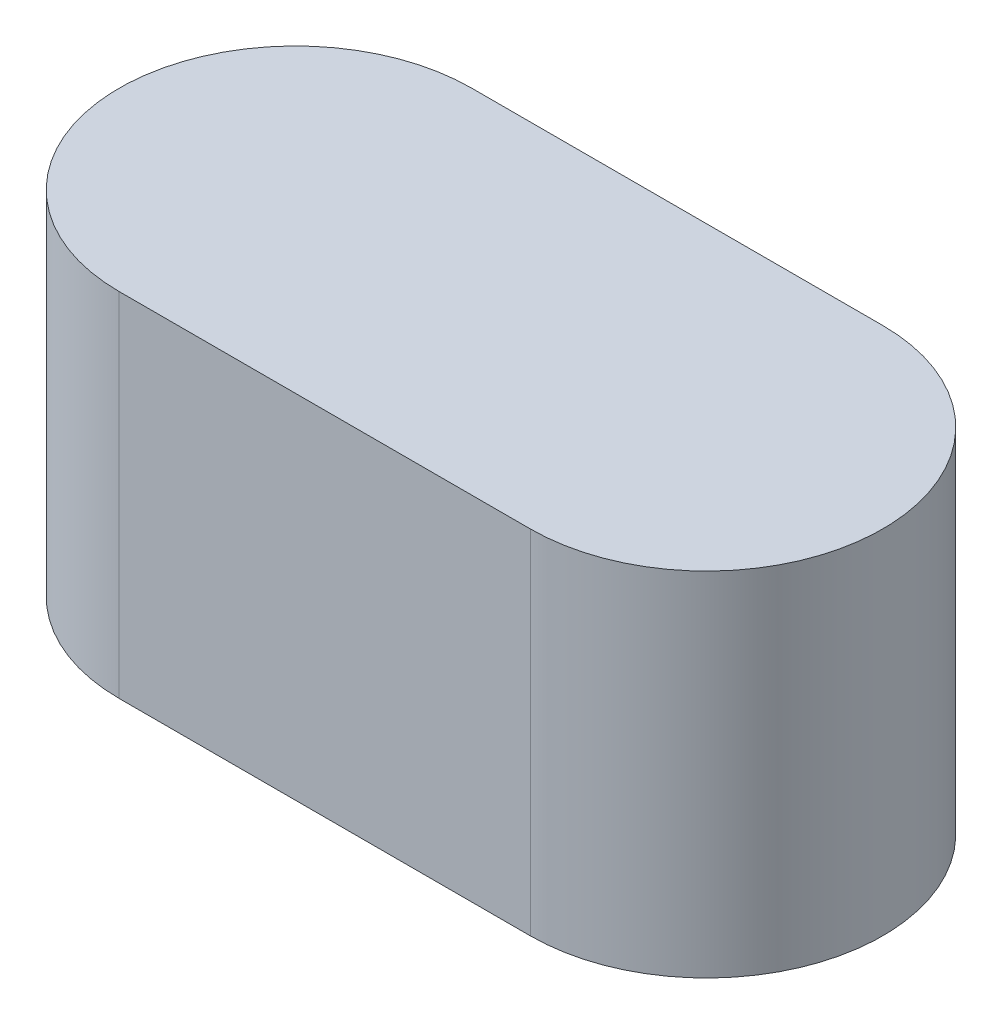
ISO-10303-21;
HEADER;
FILE_DESCRIPTION(('STEP AP214'),'2;1');
FILE_NAME('part.step','',(''),(''),'','','');
FILE_SCHEMA(('AUTOMOTIVE_DESIGN { 1 0 10303 214 1 1 1 1 }'));
ENDSEC;
DATA;
#1=APPLICATION_CONTEXT('core data for automotive mechanical design processes');
#2=APPLICATION_PROTOCOL_DEFINITION('international standard','automotive_design',2000,#1);
#3=PRODUCT_CONTEXT('',#1,'mechanical');
#4=PRODUCT('Part','Part','',(#3));
#5=PRODUCT_RELATED_PRODUCT_CATEGORY('part','',(#4));
#6=PRODUCT_DEFINITION_FORMATION('','',#4);
#7=PRODUCT_DEFINITION_CONTEXT('part definition',#1,'design');
#8=PRODUCT_DEFINITION('design','',#6,#7);
#9=PRODUCT_DEFINITION_SHAPE('','',#8);
#10=(LENGTH_UNIT() NAMED_UNIT(*) SI_UNIT(.MILLI.,.METRE.));
#11=(NAMED_UNIT(*) PLANE_ANGLE_UNIT() SI_UNIT($,.RADIAN.));
#12=(NAMED_UNIT(*) SI_UNIT($,.STERADIAN.) SOLID_ANGLE_UNIT());
#13=UNCERTAINTY_MEASURE_WITH_UNIT(LENGTH_MEASURE(1.E-05),#10,'distance_accuracy_value','');
#14=(GEOMETRIC_REPRESENTATION_CONTEXT(3) GLOBAL_UNCERTAINTY_ASSIGNED_CONTEXT((#13)) GLOBAL_UNIT_ASSIGNED_CONTEXT((#10,
#11,#12)) REPRESENTATION_CONTEXT('',''));
#15=CARTESIAN_POINT('',(0.,0.,0.));
#16=DIRECTION('',(0.,0.,1.));
#17=DIRECTION('',(1.,0.,0.));
#18=AXIS2_PLACEMENT_3D('',#15,#16,#17);
#19=CARTESIAN_POINT('',(3.5,6.,0.));
#20=DIRECTION('',(0.,-1.,0.));
#21=DIRECTION('',(0.,0.,-1.));
#22=AXIS2_PLACEMENT_3D('',#19,#20,#21);
#23=CYLINDRICAL_SURFACE('',#22,3.);
#24=CARTESIAN_POINT('',(3.5,0.,0.));
#25=DIRECTION('',(0.,1.,0.));
#26=DIRECTION('',(0.,0.,1.));
#27=AXIS2_PLACEMENT_3D('',#24,#25,#26);
#28=CIRCLE('',#27,3.);
#29=CARTESIAN_POINT('',(3.5,0.,3.));
#30=VERTEX_POINT('',#29);
#31=CARTESIAN_POINT('',(3.5,0.,-3.));
#32=VERTEX_POINT('',#31);
#33=EDGE_CURVE('E107',#30,#32,#28,.T.);
#34=ORIENTED_EDGE('',*,*,#33,.T.);
#35=DIRECTION('',(0.,-1.,0.));
#36=VECTOR('',#35,1.);
#37=CARTESIAN_POINT('',(3.5,6.,-3.));
#38=LINE('',#37,#36);
#39=CARTESIAN_POINT('',(3.5,6.,-3.));
#40=VERTEX_POINT('',#39);
#41=EDGE_CURVE('E11',#40,#32,#38,.T.);
#42=ORIENTED_EDGE('',*,*,#41,.F.);
#43=CARTESIAN_POINT('',(3.5,6.,0.));
#44=DIRECTION('',(0.,1.,0.));
#45=DIRECTION('',(0.,0.,1.));
#46=AXIS2_PLACEMENT_3D('',#43,#44,#45);
#47=CIRCLE('',#46,3.);
#48=CARTESIAN_POINT('',(3.5,6.,3.));
#49=VERTEX_POINT('',#48);
#50=EDGE_CURVE('E91',#49,#40,#47,.T.);
#51=ORIENTED_EDGE('',*,*,#50,.F.);
#52=DIRECTION('',(0.,-1.,0.));
#53=VECTOR('',#52,1.);
#54=CARTESIAN_POINT('',(3.5,6.,3.));
#55=LINE('',#54,#53);
#56=EDGE_CURVE('E103',#49,#30,#55,.T.);
#57=ORIENTED_EDGE('',*,*,#56,.T.);
#58=EDGE_LOOP('',(#34,#42,#51,#57));
#59=FACE_BOUND('',#58,.T.);
#60=ADVANCED_FACE('F39',(#59),#23,.T.);
#61=CARTESIAN_POINT('',(-3.5,6.,-3.));
#62=DIRECTION('',(0.,0.,1.));
#63=DIRECTION('',(1.,0.,0.));
#64=AXIS2_PLACEMENT_3D('',#61,#62,#63);
#65=PLANE('',#64);
#66=DIRECTION('',(-1.,0.,0.));
#67=VECTOR('',#66,1.);
#68=CARTESIAN_POINT('',(-3.5,0.,-3.));
#69=LINE('',#68,#67);
#70=CARTESIAN_POINT('',(-3.5,0.,-3.));
#71=VERTEX_POINT('',#70);
#72=EDGE_CURVE('E96',#32,#71,#69,.T.);
#73=ORIENTED_EDGE('',*,*,#72,.T.);
#74=DIRECTION('',(0.,-1.,0.));
#75=VECTOR('',#74,1.);
#76=CARTESIAN_POINT('',(-3.5,6.,-3.));
#77=LINE('',#76,#75);
#78=CARTESIAN_POINT('',(-3.5,6.,-3.));
#79=VERTEX_POINT('',#78);
#80=EDGE_CURVE('E48',#79,#71,#77,.T.);
#81=ORIENTED_EDGE('',*,*,#80,.F.);
#82=DIRECTION('',(-1.,0.,0.));
#83=VECTOR('',#82,1.);
#84=CARTESIAN_POINT('',(-3.5,6.,-3.));
#85=LINE('',#84,#83);
#86=EDGE_CURVE('E86',#40,#79,#85,.T.);
#87=ORIENTED_EDGE('',*,*,#86,.F.);
#88=ORIENTED_EDGE('',*,*,#41,.T.);
#89=EDGE_LOOP('',(#73,#81,#87,#88));
#90=FACE_BOUND('',#89,.T.);
#91=ADVANCED_FACE('F95',(#90),#65,.F.);
#92=CARTESIAN_POINT('',(-3.5,6.,0.));
#93=DIRECTION('',(0.,-1.,0.));
#94=DIRECTION('',(0.,0.,-1.));
#95=AXIS2_PLACEMENT_3D('',#92,#93,#94);
#96=CYLINDRICAL_SURFACE('',#95,3.);
#97=CARTESIAN_POINT('',(-3.5,0.,0.));
#98=DIRECTION('',(0.,1.,0.));
#99=DIRECTION('',(0.,0.,1.));
#100=AXIS2_PLACEMENT_3D('',#97,#98,#99);
#101=CIRCLE('',#100,3.);
#102=CARTESIAN_POINT('',(-3.5,0.,3.));
#103=VERTEX_POINT('',#102);
#104=EDGE_CURVE('E73',#71,#103,#101,.T.);
#105=ORIENTED_EDGE('',*,*,#104,.T.);
#106=DIRECTION('',(0.,-1.,0.));
#107=VECTOR('',#106,1.);
#108=CARTESIAN_POINT('',(-3.5,6.,3.));
#109=LINE('',#108,#107);
#110=CARTESIAN_POINT('',(-3.5,6.,3.));
#111=VERTEX_POINT('',#110);
#112=EDGE_CURVE('E98',#111,#103,#109,.T.);
#113=ORIENTED_EDGE('',*,*,#112,.F.);
#114=CARTESIAN_POINT('',(-3.5,6.,0.));
#115=DIRECTION('',(0.,1.,0.));
#116=DIRECTION('',(0.,0.,1.));
#117=AXIS2_PLACEMENT_3D('',#114,#115,#116);
#118=CIRCLE('',#117,3.);
#119=EDGE_CURVE('E89',#79,#111,#118,.T.);
#120=ORIENTED_EDGE('',*,*,#119,.F.);
#121=ORIENTED_EDGE('',*,*,#80,.T.);
#122=EDGE_LOOP('',(#105,#113,#120,#121));
#123=FACE_BOUND('',#122,.T.);
#124=ADVANCED_FACE('F99',(#123),#96,.T.);
#125=CARTESIAN_POINT('',(-3.5,6.,3.));
#126=DIRECTION('',(0.,0.,-1.));
#127=DIRECTION('',(-1.,0.,0.));
#128=AXIS2_PLACEMENT_3D('',#125,#126,#127);
#129=PLANE('',#128);
#130=DIRECTION('',(1.,0.,0.));
#131=VECTOR('',#130,1.);
#132=CARTESIAN_POINT('',(-3.5,0.,3.));
#133=LINE('',#132,#131);
#134=EDGE_CURVE('E79',#103,#30,#133,.T.);
#135=ORIENTED_EDGE('',*,*,#134,.T.);
#136=ORIENTED_EDGE('',*,*,#56,.F.);
#137=DIRECTION('',(1.,0.,0.));
#138=VECTOR('',#137,1.);
#139=CARTESIAN_POINT('',(-3.5,6.,3.));
#140=LINE('',#139,#138);
#141=EDGE_CURVE('E56',#111,#49,#140,.T.);
#142=ORIENTED_EDGE('',*,*,#141,.F.);
#143=ORIENTED_EDGE('',*,*,#112,.T.);
#144=EDGE_LOOP('',(#135,#136,#142,#143));
#145=FACE_BOUND('',#144,.T.);
#146=ADVANCED_FACE('F120',(#145),#129,.F.);
#147=CARTESIAN_POINT('',(3.5,6.,0.));
#148=DIRECTION('',(0.,1.,0.));
#149=DIRECTION('',(0.,0.,1.));
#150=AXIS2_PLACEMENT_3D('',#147,#148,#149);
#151=PLANE('',#150);
#152=ORIENTED_EDGE('',*,*,#50,.T.);
#153=ORIENTED_EDGE('',*,*,#86,.T.);
#154=ORIENTED_EDGE('',*,*,#119,.T.);
#155=ORIENTED_EDGE('',*,*,#141,.T.);
#156=EDGE_LOOP('',(#152,#153,#154,#155));
#157=FACE_BOUND('',#156,.T.);
#158=ADVANCED_FACE('F87',(#157),#151,.T.);
#159=CARTESIAN_POINT('',(3.5,0.,0.));
#160=DIRECTION('',(0.,1.,0.));
#161=DIRECTION('',(0.,0.,1.));
#162=AXIS2_PLACEMENT_3D('',#159,#160,#161);
#163=PLANE('',#162);
#164=ORIENTED_EDGE('',*,*,#33,.F.);
#165=ORIENTED_EDGE('',*,*,#134,.F.);
#166=ORIENTED_EDGE('',*,*,#104,.F.);
#167=ORIENTED_EDGE('',*,*,#72,.F.);
#168=EDGE_LOOP('',(#164,#165,#166,#167));
#169=FACE_BOUND('',#168,.T.);
#170=ADVANCED_FACE('F123',(#169),#163,.F.);
#171=CLOSED_SHELL('',(#60,#91,#124,#146,#158,#170));
#172=MANIFOLD_SOLID_BREP('B2',#171);
#173=ADVANCED_BREP_SHAPE_REPRESENTATION('',(#18,#172),#14);
#174=SHAPE_DEFINITION_REPRESENTATION(#9,#173);
ENDSEC;
END-ISO-10303-21;
